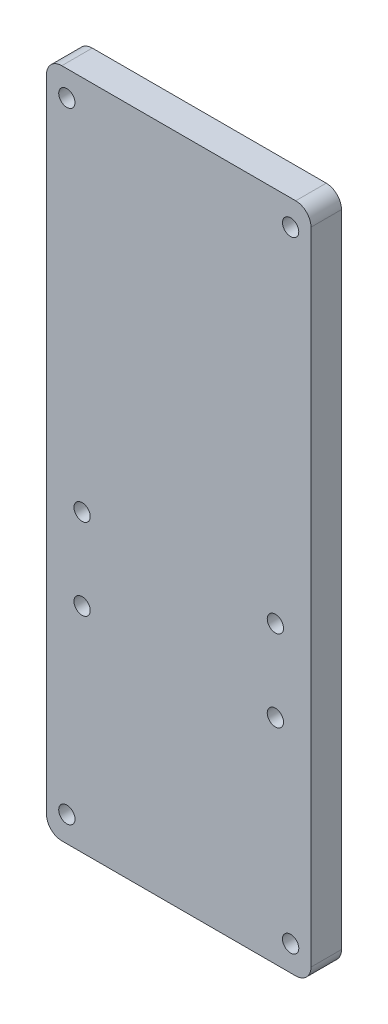
ISO-10303-21;
HEADER;
FILE_DESCRIPTION(('STEP AP214'),'2;1');
FILE_NAME('part.step','',(''),(''),'','','');
FILE_SCHEMA(('AUTOMOTIVE_DESIGN { 1 0 10303 214 1 1 1 1 }'));
ENDSEC;
DATA;
#1=APPLICATION_CONTEXT('core data for automotive mechanical design processes');
#2=APPLICATION_PROTOCOL_DEFINITION('international standard','automotive_design',2000,#1);
#3=PRODUCT_CONTEXT('',#1,'mechanical');
#4=PRODUCT('Part','Part','',(#3));
#5=PRODUCT_RELATED_PRODUCT_CATEGORY('part','',(#4));
#6=PRODUCT_DEFINITION_FORMATION('','',#4);
#7=PRODUCT_DEFINITION_CONTEXT('part definition',#1,'design');
#8=PRODUCT_DEFINITION('design','',#6,#7);
#9=PRODUCT_DEFINITION_SHAPE('','',#8);
#10=(LENGTH_UNIT() NAMED_UNIT(*) SI_UNIT(.MILLI.,.METRE.));
#11=(NAMED_UNIT(*) PLANE_ANGLE_UNIT() SI_UNIT($,.RADIAN.));
#12=(NAMED_UNIT(*) SI_UNIT($,.STERADIAN.) SOLID_ANGLE_UNIT());
#13=UNCERTAINTY_MEASURE_WITH_UNIT(LENGTH_MEASURE(1.E-05),#10,'distance_accuracy_value','');
#14=(GEOMETRIC_REPRESENTATION_CONTEXT(3) GLOBAL_UNCERTAINTY_ASSIGNED_CONTEXT((#13)) GLOBAL_UNIT_ASSIGNED_CONTEXT((#10,
#11,#12)) REPRESENTATION_CONTEXT('',''));
#15=CARTESIAN_POINT('',(0.,0.,0.));
#16=DIRECTION('',(0.,0.,1.));
#17=DIRECTION('',(1.,0.,0.));
#18=AXIS2_PLACEMENT_3D('',#15,#16,#17);
#19=CARTESIAN_POINT('',(72.2085191761689,-1.06360829735305,6.));
#20=DIRECTION('',(0.,0.,1.));
#21=DIRECTION('',(1.,0.,0.));
#22=AXIS2_PLACEMENT_3D('',#19,#20,#21);
#23=PLANE('',#22);
#24=CARTESIAN_POINT('',(71.2085191761689,0.936391702646949,6.));
#25=DIRECTION('',(0.,0.,1.));
#26=DIRECTION('',(-1.,0.,0.));
#27=AXIS2_PLACEMENT_3D('',#24,#25,#26);
#28=CIRCLE('',#27,1.60000000000001);
#29=CARTESIAN_POINT('',(69.6085191761689,0.936391702646949,6.));
#30=VERTEX_POINT('',#29);
#31=EDGE_CURVE('E213',#30,#30,#28,.T.);
#32=ORIENTED_EDGE('',*,*,#31,.F.);
#33=EDGE_LOOP('',(#32));
#34=FACE_BOUND('',#33,.T.);
#35=CARTESIAN_POINT('',(30.2077302302811,37.936391702647,6.));
#36=DIRECTION('',(0.,0.,1.));
#37=DIRECTION('',(1.,0.,0.));
#38=AXIS2_PLACEMENT_3D('',#35,#36,#37);
#39=CIRCLE('',#38,1.60000000000001);
#40=CARTESIAN_POINT('',(31.8077302302811,37.936391702647,6.));
#41=VERTEX_POINT('',#40);
#42=EDGE_CURVE('E201',#41,#41,#39,.T.);
#43=ORIENTED_EDGE('',*,*,#42,.F.);
#44=EDGE_LOOP('',(#43));
#45=FACE_BOUND('',#44,.T.);
#46=CARTESIAN_POINT('',(71.2085191761689,122.936391702647,6.));
#47=DIRECTION('',(0.,0.,1.));
#48=DIRECTION('',(1.,0.,0.));
#49=AXIS2_PLACEMENT_3D('',#46,#47,#48);
#50=CIRCLE('',#49,1.60000000000001);
#51=CARTESIAN_POINT('',(72.8085191761689,122.936391702647,6.));
#52=VERTEX_POINT('',#51);
#53=EDGE_CURVE('E189',#52,#52,#50,.T.);
#54=ORIENTED_EDGE('',*,*,#53,.F.);
#55=EDGE_LOOP('',(#54));
#56=FACE_BOUND('',#55,.T.);
#57=CARTESIAN_POINT('',(30.2077302302811,53.936391702647,6.));
#58=DIRECTION('',(0.,0.,1.));
#59=DIRECTION('',(1.,0.,0.));
#60=AXIS2_PLACEMENT_3D('',#57,#58,#59);
#61=CIRCLE('',#60,1.60000000000001);
#62=CARTESIAN_POINT('',(31.8077302302811,53.936391702647,6.));
#63=VERTEX_POINT('',#62);
#64=EDGE_CURVE('E135',#63,#63,#61,.T.);
#65=ORIENTED_EDGE('',*,*,#64,.F.);
#66=EDGE_LOOP('',(#65));
#67=FACE_BOUND('',#66,.T.);
#68=CARTESIAN_POINT('',(72.2085191761689,-1.06360829735305,6.));
#69=DIRECTION('',(0.,0.,1.));
#70=DIRECTION('',(1.,0.,0.));
#71=AXIS2_PLACEMENT_3D('',#68,#69,#70);
#72=CIRCLE('',#71,2.99999999999999);
#73=CARTESIAN_POINT('',(72.2085191761689,-4.06360829735305,6.));
#74=VERTEX_POINT('',#73);
#75=CARTESIAN_POINT('',(75.2085191761689,-1.06360829735305,6.));
#76=VERTEX_POINT('',#75);
#77=EDGE_CURVE('E146',#74,#76,#72,.T.);
#78=ORIENTED_EDGE('',*,*,#77,.T.);
#79=DIRECTION('',(0.,1.,0.));
#80=VECTOR('',#79,1.);
#81=CARTESIAN_POINT('',(75.2085191761689,124.936391702647,6.));
#82=LINE('',#81,#80);
#83=CARTESIAN_POINT('',(75.2085191761689,124.936391702647,6.));
#84=VERTEX_POINT('',#83);
#85=EDGE_CURVE('E94',#76,#84,#82,.T.);
#86=ORIENTED_EDGE('',*,*,#85,.T.);
#87=CARTESIAN_POINT('',(72.2085191761689,124.936391702647,6.));
#88=DIRECTION('',(0.,0.,1.));
#89=DIRECTION('',(-1.,0.,0.));
#90=AXIS2_PLACEMENT_3D('',#87,#88,#89);
#91=CIRCLE('',#90,3.);
#92=CARTESIAN_POINT('',(72.2085191761689,127.936391702647,6.));
#93=VERTEX_POINT('',#92);
#94=EDGE_CURVE('E161',#84,#93,#91,.T.);
#95=ORIENTED_EDGE('',*,*,#94,.T.);
#96=DIRECTION('',(-1.,0.,0.));
#97=VECTOR('',#96,1.);
#98=CARTESIAN_POINT('',(26.2069412843933,127.936391702647,6.));
#99=LINE('',#98,#97);
#100=CARTESIAN_POINT('',(26.2069412843933,127.936391702647,6.));
#101=VERTEX_POINT('',#100);
#102=EDGE_CURVE('E174',#93,#101,#99,.T.);
#103=ORIENTED_EDGE('',*,*,#102,.T.);
#104=CARTESIAN_POINT('',(26.2069412843933,124.936391702647,6.));
#105=DIRECTION('',(0.,0.,1.));
#106=DIRECTION('',(1.,0.,0.));
#107=AXIS2_PLACEMENT_3D('',#104,#105,#106);
#108=CIRCLE('',#107,3.);
#109=CARTESIAN_POINT('',(23.2069412843933,124.936391702647,6.));
#110=VERTEX_POINT('',#109);
#111=EDGE_CURVE('E113',#101,#110,#108,.T.);
#112=ORIENTED_EDGE('',*,*,#111,.T.);
#113=DIRECTION('',(0.,-1.,0.));
#114=VECTOR('',#113,1.);
#115=CARTESIAN_POINT('',(23.2069412843933,124.936391702647,6.));
#116=LINE('',#115,#114);
#117=CARTESIAN_POINT('',(23.2069412843933,-1.06360829735305,6.));
#118=VERTEX_POINT('',#117);
#119=EDGE_CURVE('E107',#110,#118,#116,.T.);
#120=ORIENTED_EDGE('',*,*,#119,.T.);
#121=CARTESIAN_POINT('',(26.2069412843933,-1.06360829735305,6.));
#122=DIRECTION('',(0.,0.,1.));
#123=DIRECTION('',(-1.,0.,0.));
#124=AXIS2_PLACEMENT_3D('',#121,#122,#123);
#125=CIRCLE('',#124,2.99999999999999);
#126=CARTESIAN_POINT('',(26.2069412843933,-4.06360829735305,6.));
#127=VERTEX_POINT('',#126);
#128=EDGE_CURVE('E111',#118,#127,#125,.T.);
#129=ORIENTED_EDGE('',*,*,#128,.T.);
#130=DIRECTION('',(1.,0.,0.));
#131=VECTOR('',#130,1.);
#132=CARTESIAN_POINT('',(26.2069412843933,-4.06360829735305,6.));
#133=LINE('',#132,#131);
#134=EDGE_CURVE('E51',#127,#74,#133,.T.);
#135=ORIENTED_EDGE('',*,*,#134,.T.);
#136=EDGE_LOOP('',(#78,#86,#95,#103,#112,#120,#129,#135));
#137=FACE_BOUND('',#136,.T.);
#138=CARTESIAN_POINT('',(27.2069412843933,0.936391702646949,6.));
#139=DIRECTION('',(0.,0.,1.));
#140=DIRECTION('',(1.,0.,0.));
#141=AXIS2_PLACEMENT_3D('',#138,#139,#140);
#142=CIRCLE('',#141,1.60000000000001);
#143=CARTESIAN_POINT('',(28.8069412843933,0.936391702646949,6.));
#144=VERTEX_POINT('',#143);
#145=EDGE_CURVE('E183',#144,#144,#142,.T.);
#146=ORIENTED_EDGE('',*,*,#145,.F.);
#147=EDGE_LOOP('',(#146));
#148=FACE_BOUND('',#147,.T.);
#149=CARTESIAN_POINT('',(27.2069412843933,122.936391702647,6.));
#150=DIRECTION('',(0.,0.,1.));
#151=DIRECTION('',(-1.,0.,0.));
#152=AXIS2_PLACEMENT_3D('',#149,#150,#151);
#153=CIRCLE('',#152,1.60000000000001);
#154=CARTESIAN_POINT('',(25.6069412843933,122.936391702647,6.));
#155=VERTEX_POINT('',#154);
#156=EDGE_CURVE('E195',#155,#155,#153,.T.);
#157=ORIENTED_EDGE('',*,*,#156,.F.);
#158=EDGE_LOOP('',(#157));
#159=FACE_BOUND('',#158,.T.);
#160=CARTESIAN_POINT('',(68.2077302302811,37.936391702647,6.));
#161=DIRECTION('',(0.,0.,1.));
#162=DIRECTION('',(1.,0.,0.));
#163=AXIS2_PLACEMENT_3D('',#160,#161,#162);
#164=CIRCLE('',#163,1.60000000000001);
#165=CARTESIAN_POINT('',(69.8077302302811,37.936391702647,6.));
#166=VERTEX_POINT('',#165);
#167=EDGE_CURVE('E207',#166,#166,#164,.T.);
#168=ORIENTED_EDGE('',*,*,#167,.F.);
#169=EDGE_LOOP('',(#168));
#170=FACE_BOUND('',#169,.T.);
#171=CARTESIAN_POINT('',(68.2077302302811,53.936391702647,6.));
#172=DIRECTION('',(0.,0.,1.));
#173=DIRECTION('',(-1.,0.,0.));
#174=AXIS2_PLACEMENT_3D('',#171,#172,#173);
#175=CIRCLE('',#174,1.60000000000001);
#176=CARTESIAN_POINT('',(66.6077302302811,53.936391702647,6.));
#177=VERTEX_POINT('',#176);
#178=EDGE_CURVE('E219',#177,#177,#175,.T.);
#179=ORIENTED_EDGE('',*,*,#178,.F.);
#180=EDGE_LOOP('',(#179));
#181=FACE_BOUND('',#180,.T.);
#182=ADVANCED_FACE('F34',(#34,#45,#56,#67,#137,#148,#159,#170,#181),#23,.T.);
#183=CARTESIAN_POINT('',(72.2085191761689,-1.06360829735305,0.));
#184=DIRECTION('',(0.,0.,1.));
#185=DIRECTION('',(1.,0.,0.));
#186=AXIS2_PLACEMENT_3D('',#183,#184,#185);
#187=PLANE('',#186);
#188=CARTESIAN_POINT('',(71.2085191761689,0.936391702646949,0.));
#189=DIRECTION('',(0.,0.,1.));
#190=DIRECTION('',(-1.,0.,0.));
#191=AXIS2_PLACEMENT_3D('',#188,#189,#190);
#192=CIRCLE('',#191,1.60000000000001);
#193=CARTESIAN_POINT('',(69.6085191761689,0.936391702646949,0.));
#194=VERTEX_POINT('',#193);
#195=EDGE_CURVE('E216',#194,#194,#192,.T.);
#196=ORIENTED_EDGE('',*,*,#195,.T.);
#197=EDGE_LOOP('',(#196));
#198=FACE_BOUND('',#197,.T.);
#199=CARTESIAN_POINT('',(30.2077302302811,37.936391702647,0.));
#200=DIRECTION('',(0.,0.,1.));
#201=DIRECTION('',(1.,0.,0.));
#202=AXIS2_PLACEMENT_3D('',#199,#200,#201);
#203=CIRCLE('',#202,1.60000000000001);
#204=CARTESIAN_POINT('',(31.8077302302811,37.936391702647,0.));
#205=VERTEX_POINT('',#204);
#206=EDGE_CURVE('E204',#205,#205,#203,.T.);
#207=ORIENTED_EDGE('',*,*,#206,.T.);
#208=EDGE_LOOP('',(#207));
#209=FACE_BOUND('',#208,.T.);
#210=CARTESIAN_POINT('',(71.2085191761689,122.936391702647,0.));
#211=DIRECTION('',(0.,0.,1.));
#212=DIRECTION('',(1.,0.,0.));
#213=AXIS2_PLACEMENT_3D('',#210,#211,#212);
#214=CIRCLE('',#213,1.60000000000001);
#215=CARTESIAN_POINT('',(72.8085191761689,122.936391702647,0.));
#216=VERTEX_POINT('',#215);
#217=EDGE_CURVE('E192',#216,#216,#214,.T.);
#218=ORIENTED_EDGE('',*,*,#217,.T.);
#219=EDGE_LOOP('',(#218));
#220=FACE_BOUND('',#219,.T.);
#221=CARTESIAN_POINT('',(30.2077302302811,53.936391702647,0.));
#222=DIRECTION('',(0.,0.,1.));
#223=DIRECTION('',(1.,0.,0.));
#224=AXIS2_PLACEMENT_3D('',#221,#222,#223);
#225=CIRCLE('',#224,1.60000000000001);
#226=CARTESIAN_POINT('',(31.8077302302811,53.936391702647,0.));
#227=VERTEX_POINT('',#226);
#228=EDGE_CURVE('E180',#227,#227,#225,.T.);
#229=ORIENTED_EDGE('',*,*,#228,.T.);
#230=EDGE_LOOP('',(#229));
#231=FACE_BOUND('',#230,.T.);
#232=CARTESIAN_POINT('',(72.2085191761689,-1.06360829735305,0.));
#233=DIRECTION('',(0.,0.,1.));
#234=DIRECTION('',(1.,0.,0.));
#235=AXIS2_PLACEMENT_3D('',#232,#233,#234);
#236=CIRCLE('',#235,2.99999999999999);
#237=CARTESIAN_POINT('',(72.2085191761689,-4.06360829735305,0.));
#238=VERTEX_POINT('',#237);
#239=CARTESIAN_POINT('',(75.2085191761689,-1.06360829735305,0.));
#240=VERTEX_POINT('',#239);
#241=EDGE_CURVE('E131',#238,#240,#236,.T.);
#242=ORIENTED_EDGE('',*,*,#241,.F.);
#243=DIRECTION('',(1.,0.,0.));
#244=VECTOR('',#243,1.);
#245=CARTESIAN_POINT('',(26.2069412843933,-4.06360829735305,0.));
#246=LINE('',#245,#244);
#247=CARTESIAN_POINT('',(26.2069412843933,-4.06360829735305,0.));
#248=VERTEX_POINT('',#247);
#249=EDGE_CURVE('E86',#248,#238,#246,.T.);
#250=ORIENTED_EDGE('',*,*,#249,.F.);
#251=CARTESIAN_POINT('',(26.2069412843933,-1.06360829735305,0.));
#252=DIRECTION('',(0.,0.,1.));
#253=DIRECTION('',(-1.,0.,0.));
#254=AXIS2_PLACEMENT_3D('',#251,#252,#253);
#255=CIRCLE('',#254,2.99999999999999);
#256=CARTESIAN_POINT('',(23.2069412843933,-1.06360829735305,0.));
#257=VERTEX_POINT('',#256);
#258=EDGE_CURVE('E80',#257,#248,#255,.T.);
#259=ORIENTED_EDGE('',*,*,#258,.F.);
#260=DIRECTION('',(0.,-1.,0.));
#261=VECTOR('',#260,1.);
#262=CARTESIAN_POINT('',(23.2069412843933,124.936391702647,0.));
#263=LINE('',#262,#261);
#264=CARTESIAN_POINT('',(23.2069412843933,124.936391702647,0.));
#265=VERTEX_POINT('',#264);
#266=EDGE_CURVE('E121',#265,#257,#263,.T.);
#267=ORIENTED_EDGE('',*,*,#266,.F.);
#268=CARTESIAN_POINT('',(26.2069412843933,124.936391702647,0.));
#269=DIRECTION('',(0.,0.,1.));
#270=DIRECTION('',(1.,0.,0.));
#271=AXIS2_PLACEMENT_3D('',#268,#269,#270);
#272=CIRCLE('',#271,3.);
#273=CARTESIAN_POINT('',(26.2069412843933,127.936391702647,0.));
#274=VERTEX_POINT('',#273);
#275=EDGE_CURVE('E141',#274,#265,#272,.T.);
#276=ORIENTED_EDGE('',*,*,#275,.F.);
#277=DIRECTION('',(-1.,0.,0.));
#278=VECTOR('',#277,1.);
#279=CARTESIAN_POINT('',(26.2069412843933,127.936391702647,0.));
#280=LINE('',#279,#278);
#281=CARTESIAN_POINT('',(72.2085191761689,127.936391702647,0.));
#282=VERTEX_POINT('',#281);
#283=EDGE_CURVE('E139',#282,#274,#280,.T.);
#284=ORIENTED_EDGE('',*,*,#283,.F.);
#285=CARTESIAN_POINT('',(72.2085191761689,124.936391702647,0.));
#286=DIRECTION('',(0.,0.,1.));
#287=DIRECTION('',(-1.,0.,0.));
#288=AXIS2_PLACEMENT_3D('',#285,#286,#287);
#289=CIRCLE('',#288,3.);
#290=CARTESIAN_POINT('',(75.2085191761689,124.936391702647,0.));
#291=VERTEX_POINT('',#290);
#292=EDGE_CURVE('E137',#291,#282,#289,.T.);
#293=ORIENTED_EDGE('',*,*,#292,.F.);
#294=DIRECTION('',(0.,1.,0.));
#295=VECTOR('',#294,1.);
#296=CARTESIAN_POINT('',(75.2085191761689,124.936391702647,0.));
#297=LINE('',#296,#295);
#298=EDGE_CURVE('E134',#240,#291,#297,.T.);
#299=ORIENTED_EDGE('',*,*,#298,.F.);
#300=EDGE_LOOP('',(#242,#250,#259,#267,#276,#284,#293,#299));
#301=FACE_BOUND('',#300,.T.);
#302=CARTESIAN_POINT('',(27.2069412843933,0.936391702646949,0.));
#303=DIRECTION('',(0.,0.,1.));
#304=DIRECTION('',(1.,0.,0.));
#305=AXIS2_PLACEMENT_3D('',#302,#303,#304);
#306=CIRCLE('',#305,1.60000000000001);
#307=CARTESIAN_POINT('',(28.8069412843933,0.936391702646949,0.));
#308=VERTEX_POINT('',#307);
#309=EDGE_CURVE('E186',#308,#308,#306,.T.);
#310=ORIENTED_EDGE('',*,*,#309,.T.);
#311=EDGE_LOOP('',(#310));
#312=FACE_BOUND('',#311,.T.);
#313=CARTESIAN_POINT('',(27.2069412843933,122.936391702647,0.));
#314=DIRECTION('',(0.,0.,1.));
#315=DIRECTION('',(-1.,0.,0.));
#316=AXIS2_PLACEMENT_3D('',#313,#314,#315);
#317=CIRCLE('',#316,1.60000000000001);
#318=CARTESIAN_POINT('',(25.6069412843933,122.936391702647,0.));
#319=VERTEX_POINT('',#318);
#320=EDGE_CURVE('E198',#319,#319,#317,.T.);
#321=ORIENTED_EDGE('',*,*,#320,.T.);
#322=EDGE_LOOP('',(#321));
#323=FACE_BOUND('',#322,.T.);
#324=CARTESIAN_POINT('',(68.2077302302811,37.936391702647,0.));
#325=DIRECTION('',(0.,0.,1.));
#326=DIRECTION('',(1.,0.,0.));
#327=AXIS2_PLACEMENT_3D('',#324,#325,#326);
#328=CIRCLE('',#327,1.60000000000001);
#329=CARTESIAN_POINT('',(69.8077302302811,37.936391702647,0.));
#330=VERTEX_POINT('',#329);
#331=EDGE_CURVE('E210',#330,#330,#328,.T.);
#332=ORIENTED_EDGE('',*,*,#331,.T.);
#333=EDGE_LOOP('',(#332));
#334=FACE_BOUND('',#333,.T.);
#335=CARTESIAN_POINT('',(68.2077302302811,53.936391702647,0.));
#336=DIRECTION('',(0.,0.,1.));
#337=DIRECTION('',(-1.,0.,0.));
#338=AXIS2_PLACEMENT_3D('',#335,#336,#337);
#339=CIRCLE('',#338,1.60000000000001);
#340=CARTESIAN_POINT('',(66.6077302302811,53.936391702647,0.));
#341=VERTEX_POINT('',#340);
#342=EDGE_CURVE('E222',#341,#341,#339,.T.);
#343=ORIENTED_EDGE('',*,*,#342,.T.);
#344=EDGE_LOOP('',(#343));
#345=FACE_BOUND('',#344,.T.);
#346=ADVANCED_FACE('F165',(#198,#209,#220,#231,#301,#312,#323,#334,#345),#187,.F.);
#347=CARTESIAN_POINT('',(72.2085191761689,-1.06360829735305,6.));
#348=DIRECTION('',(0.,0.,-1.));
#349=DIRECTION('',(-1.,0.,0.));
#350=AXIS2_PLACEMENT_3D('',#347,#348,#349);
#351=CYLINDRICAL_SURFACE('',#350,2.99999999999999);
#352=ORIENTED_EDGE('',*,*,#241,.T.);
#353=DIRECTION('',(0.,0.,-1.));
#354=VECTOR('',#353,1.);
#355=CARTESIAN_POINT('',(75.2085191761689,-1.06360829735305,6.));
#356=LINE('',#355,#354);
#357=EDGE_CURVE('E11',#76,#240,#356,.T.);
#358=ORIENTED_EDGE('',*,*,#357,.F.);
#359=ORIENTED_EDGE('',*,*,#77,.F.);
#360=DIRECTION('',(0.,0.,-1.));
#361=VECTOR('',#360,1.);
#362=CARTESIAN_POINT('',(72.2085191761689,-4.06360829735305,6.));
#363=LINE('',#362,#361);
#364=EDGE_CURVE('E127',#74,#238,#363,.T.);
#365=ORIENTED_EDGE('',*,*,#364,.T.);
#366=EDGE_LOOP('',(#352,#358,#359,#365));
#367=FACE_BOUND('',#366,.T.);
#368=ADVANCED_FACE('F36',(#367),#351,.T.);
#369=CARTESIAN_POINT('',(75.2085191761689,124.936391702647,6.));
#370=DIRECTION('',(-1.,0.,0.));
#371=DIRECTION('',(0.,-1.,0.));
#372=AXIS2_PLACEMENT_3D('',#369,#370,#371);
#373=PLANE('',#372);
#374=ORIENTED_EDGE('',*,*,#298,.T.);
#375=DIRECTION('',(0.,0.,-1.));
#376=VECTOR('',#375,1.);
#377=CARTESIAN_POINT('',(75.2085191761689,124.936391702647,6.));
#378=LINE('',#377,#376);
#379=EDGE_CURVE('E43',#84,#291,#378,.T.);
#380=ORIENTED_EDGE('',*,*,#379,.F.);
#381=ORIENTED_EDGE('',*,*,#85,.F.);
#382=ORIENTED_EDGE('',*,*,#357,.T.);
#383=EDGE_LOOP('',(#374,#380,#381,#382));
#384=FACE_BOUND('',#383,.T.);
#385=ADVANCED_FACE('F257',(#384),#373,.F.);
#386=CARTESIAN_POINT('',(72.2085191761689,124.936391702647,6.));
#387=DIRECTION('',(0.,0.,-1.));
#388=DIRECTION('',(-1.,0.,0.));
#389=AXIS2_PLACEMENT_3D('',#386,#387,#388);
#390=CYLINDRICAL_SURFACE('',#389,3.);
#391=ORIENTED_EDGE('',*,*,#292,.T.);
#392=DIRECTION('',(0.,0.,-1.));
#393=VECTOR('',#392,1.);
#394=CARTESIAN_POINT('',(72.2085191761689,127.936391702647,6.));
#395=LINE('',#394,#393);
#396=EDGE_CURVE('E153',#93,#282,#395,.T.);
#397=ORIENTED_EDGE('',*,*,#396,.F.);
#398=ORIENTED_EDGE('',*,*,#94,.F.);
#399=ORIENTED_EDGE('',*,*,#379,.T.);
#400=EDGE_LOOP('',(#391,#397,#398,#399));
#401=FACE_BOUND('',#400,.T.);
#402=ADVANCED_FACE('F159',(#401),#390,.T.);
#403=CARTESIAN_POINT('',(26.2069412843933,127.936391702647,6.));
#404=DIRECTION('',(0.,-1.,0.));
#405=DIRECTION('',(0.,0.,-1.));
#406=AXIS2_PLACEMENT_3D('',#403,#404,#405);
#407=PLANE('',#406);
#408=ORIENTED_EDGE('',*,*,#283,.T.);
#409=DIRECTION('',(0.,0.,-1.));
#410=VECTOR('',#409,1.);
#411=CARTESIAN_POINT('',(26.2069412843933,127.936391702647,6.));
#412=LINE('',#411,#410);
#413=EDGE_CURVE('E150',#101,#274,#412,.T.);
#414=ORIENTED_EDGE('',*,*,#413,.F.);
#415=ORIENTED_EDGE('',*,*,#102,.F.);
#416=ORIENTED_EDGE('',*,*,#396,.T.);
#417=EDGE_LOOP('',(#408,#414,#415,#416));
#418=FACE_BOUND('',#417,.T.);
#419=ADVANCED_FACE('F170',(#418),#407,.F.);
#420=CARTESIAN_POINT('',(26.2069412843933,124.936391702647,6.));
#421=DIRECTION('',(0.,0.,-1.));
#422=DIRECTION('',(-1.,0.,0.));
#423=AXIS2_PLACEMENT_3D('',#420,#421,#422);
#424=CYLINDRICAL_SURFACE('',#423,3.);
#425=ORIENTED_EDGE('',*,*,#275,.T.);
#426=DIRECTION('',(0.,0.,-1.));
#427=VECTOR('',#426,1.);
#428=CARTESIAN_POINT('',(23.2069412843933,124.936391702647,6.));
#429=LINE('',#428,#427);
#430=EDGE_CURVE('E122',#110,#265,#429,.T.);
#431=ORIENTED_EDGE('',*,*,#430,.F.);
#432=ORIENTED_EDGE('',*,*,#111,.F.);
#433=ORIENTED_EDGE('',*,*,#413,.T.);
#434=EDGE_LOOP('',(#425,#431,#432,#433));
#435=FACE_BOUND('',#434,.T.);
#436=ADVANCED_FACE('F173',(#435),#424,.T.);
#437=CARTESIAN_POINT('',(23.2069412843933,124.936391702647,6.));
#438=DIRECTION('',(1.,0.,0.));
#439=DIRECTION('',(0.,1.,0.));
#440=AXIS2_PLACEMENT_3D('',#437,#438,#439);
#441=PLANE('',#440);
#442=ORIENTED_EDGE('',*,*,#266,.T.);
#443=DIRECTION('',(0.,0.,-1.));
#444=VECTOR('',#443,1.);
#445=CARTESIAN_POINT('',(23.2069412843933,-1.06360829735305,6.));
#446=LINE('',#445,#444);
#447=EDGE_CURVE('E118',#118,#257,#446,.T.);
#448=ORIENTED_EDGE('',*,*,#447,.F.);
#449=ORIENTED_EDGE('',*,*,#119,.F.);
#450=ORIENTED_EDGE('',*,*,#430,.T.);
#451=EDGE_LOOP('',(#442,#448,#449,#450));
#452=FACE_BOUND('',#451,.T.);
#453=ADVANCED_FACE('F119',(#452),#441,.F.);
#454=CARTESIAN_POINT('',(26.2069412843933,-1.06360829735305,6.));
#455=DIRECTION('',(0.,0.,-1.));
#456=DIRECTION('',(-1.,0.,0.));
#457=AXIS2_PLACEMENT_3D('',#454,#455,#456);
#458=CYLINDRICAL_SURFACE('',#457,2.99999999999999);
#459=ORIENTED_EDGE('',*,*,#258,.T.);
#460=DIRECTION('',(0.,0.,-1.));
#461=VECTOR('',#460,1.);
#462=CARTESIAN_POINT('',(26.2069412843933,-4.06360829735305,6.));
#463=LINE('',#462,#461);
#464=EDGE_CURVE('E123',#127,#248,#463,.T.);
#465=ORIENTED_EDGE('',*,*,#464,.F.);
#466=ORIENTED_EDGE('',*,*,#128,.F.);
#467=ORIENTED_EDGE('',*,*,#447,.T.);
#468=EDGE_LOOP('',(#459,#465,#466,#467));
#469=FACE_BOUND('',#468,.T.);
#470=ADVANCED_FACE('F125',(#469),#458,.T.);
#471=CARTESIAN_POINT('',(26.2069412843933,-4.06360829735305,6.));
#472=DIRECTION('',(0.,1.,0.));
#473=DIRECTION('',(0.,0.,1.));
#474=AXIS2_PLACEMENT_3D('',#471,#472,#473);
#475=PLANE('',#474);
#476=ORIENTED_EDGE('',*,*,#249,.T.);
#477=ORIENTED_EDGE('',*,*,#364,.F.);
#478=ORIENTED_EDGE('',*,*,#134,.F.);
#479=ORIENTED_EDGE('',*,*,#464,.T.);
#480=EDGE_LOOP('',(#476,#477,#478,#479));
#481=FACE_BOUND('',#480,.T.);
#482=ADVANCED_FACE('F245',(#481),#475,.F.);
#483=CARTESIAN_POINT('',(30.2077302302811,53.936391702647,6.));
#484=DIRECTION('',(0.,0.,-1.));
#485=DIRECTION('',(-1.,0.,0.));
#486=AXIS2_PLACEMENT_3D('',#483,#484,#485);
#487=CYLINDRICAL_SURFACE('',#486,1.60000000000001);
#488=ORIENTED_EDGE('',*,*,#64,.T.);
#489=EDGE_LOOP('',(#488));
#490=FACE_BOUND('',#489,.T.);
#491=ORIENTED_EDGE('',*,*,#228,.F.);
#492=EDGE_LOOP('',(#491));
#493=FACE_BOUND('',#492,.T.);
#494=ADVANCED_FACE('F242',(#490,#493),#487,.F.);
#495=CARTESIAN_POINT('',(27.2069412843933,0.936391702646949,6.));
#496=DIRECTION('',(0.,0.,-1.));
#497=DIRECTION('',(-1.,0.,0.));
#498=AXIS2_PLACEMENT_3D('',#495,#496,#497);
#499=CYLINDRICAL_SURFACE('',#498,1.60000000000001);
#500=ORIENTED_EDGE('',*,*,#145,.T.);
#501=EDGE_LOOP('',(#500));
#502=FACE_BOUND('',#501,.T.);
#503=ORIENTED_EDGE('',*,*,#309,.F.);
#504=EDGE_LOOP('',(#503));
#505=FACE_BOUND('',#504,.T.);
#506=ADVANCED_FACE('F321',(#502,#505),#499,.F.);
#507=CARTESIAN_POINT('',(71.2085191761689,122.936391702647,6.));
#508=DIRECTION('',(0.,0.,-1.));
#509=DIRECTION('',(-1.,0.,0.));
#510=AXIS2_PLACEMENT_3D('',#507,#508,#509);
#511=CYLINDRICAL_SURFACE('',#510,1.60000000000001);
#512=ORIENTED_EDGE('',*,*,#53,.T.);
#513=EDGE_LOOP('',(#512));
#514=FACE_BOUND('',#513,.T.);
#515=ORIENTED_EDGE('',*,*,#217,.F.);
#516=EDGE_LOOP('',(#515));
#517=FACE_BOUND('',#516,.T.);
#518=ADVANCED_FACE('F329',(#514,#517),#511,.F.);
#519=CARTESIAN_POINT('',(27.2069412843933,122.936391702647,6.));
#520=DIRECTION('',(0.,0.,-1.));
#521=DIRECTION('',(-1.,0.,0.));
#522=AXIS2_PLACEMENT_3D('',#519,#520,#521);
#523=CYLINDRICAL_SURFACE('',#522,1.60000000000001);
#524=ORIENTED_EDGE('',*,*,#156,.T.);
#525=EDGE_LOOP('',(#524));
#526=FACE_BOUND('',#525,.T.);
#527=ORIENTED_EDGE('',*,*,#320,.F.);
#528=EDGE_LOOP('',(#527));
#529=FACE_BOUND('',#528,.T.);
#530=ADVANCED_FACE('F337',(#526,#529),#523,.F.);
#531=CARTESIAN_POINT('',(30.2077302302811,37.936391702647,6.));
#532=DIRECTION('',(0.,0.,-1.));
#533=DIRECTION('',(-1.,0.,0.));
#534=AXIS2_PLACEMENT_3D('',#531,#532,#533);
#535=CYLINDRICAL_SURFACE('',#534,1.60000000000001);
#536=ORIENTED_EDGE('',*,*,#42,.T.);
#537=EDGE_LOOP('',(#536));
#538=FACE_BOUND('',#537,.T.);
#539=ORIENTED_EDGE('',*,*,#206,.F.);
#540=EDGE_LOOP('',(#539));
#541=FACE_BOUND('',#540,.T.);
#542=ADVANCED_FACE('F346',(#538,#541),#535,.F.);
#543=CARTESIAN_POINT('',(68.2077302302811,37.936391702647,6.));
#544=DIRECTION('',(0.,0.,-1.));
#545=DIRECTION('',(-1.,0.,0.));
#546=AXIS2_PLACEMENT_3D('',#543,#544,#545);
#547=CYLINDRICAL_SURFACE('',#546,1.60000000000001);
#548=ORIENTED_EDGE('',*,*,#167,.T.);
#549=EDGE_LOOP('',(#548));
#550=FACE_BOUND('',#549,.T.);
#551=ORIENTED_EDGE('',*,*,#331,.F.);
#552=EDGE_LOOP('',(#551));
#553=FACE_BOUND('',#552,.T.);
#554=ADVANCED_FACE('F355',(#550,#553),#547,.F.);
#555=CARTESIAN_POINT('',(71.2085191761689,0.936391702646949,6.));
#556=DIRECTION('',(0.,0.,-1.));
#557=DIRECTION('',(-1.,0.,0.));
#558=AXIS2_PLACEMENT_3D('',#555,#556,#557);
#559=CYLINDRICAL_SURFACE('',#558,1.60000000000001);
#560=ORIENTED_EDGE('',*,*,#31,.T.);
#561=EDGE_LOOP('',(#560));
#562=FACE_BOUND('',#561,.T.);
#563=ORIENTED_EDGE('',*,*,#195,.F.);
#564=EDGE_LOOP('',(#563));
#565=FACE_BOUND('',#564,.T.);
#566=ADVANCED_FACE('F364',(#562,#565),#559,.F.);
#567=CARTESIAN_POINT('',(68.2077302302811,53.936391702647,6.));
#568=DIRECTION('',(0.,0.,-1.));
#569=DIRECTION('',(-1.,0.,0.));
#570=AXIS2_PLACEMENT_3D('',#567,#568,#569);
#571=CYLINDRICAL_SURFACE('',#570,1.60000000000001);
#572=ORIENTED_EDGE('',*,*,#178,.T.);
#573=EDGE_LOOP('',(#572));
#574=FACE_BOUND('',#573,.T.);
#575=ORIENTED_EDGE('',*,*,#342,.F.);
#576=EDGE_LOOP('',(#575));
#577=FACE_BOUND('',#576,.T.);
#578=ADVANCED_FACE('F228',(#574,#577),#571,.F.);
#579=CLOSED_SHELL('',(#182,#346,#368,#385,#402,#419,#436,#453,#470,#482,#494,#506,#518,#530,
#542,#554,#566,#578));
#580=MANIFOLD_SOLID_BREP('B2',#579);
#581=ADVANCED_BREP_SHAPE_REPRESENTATION('',(#18,#580),#14);
#582=SHAPE_DEFINITION_REPRESENTATION(#9,#581);
ENDSEC;
END-ISO-10303-21;
